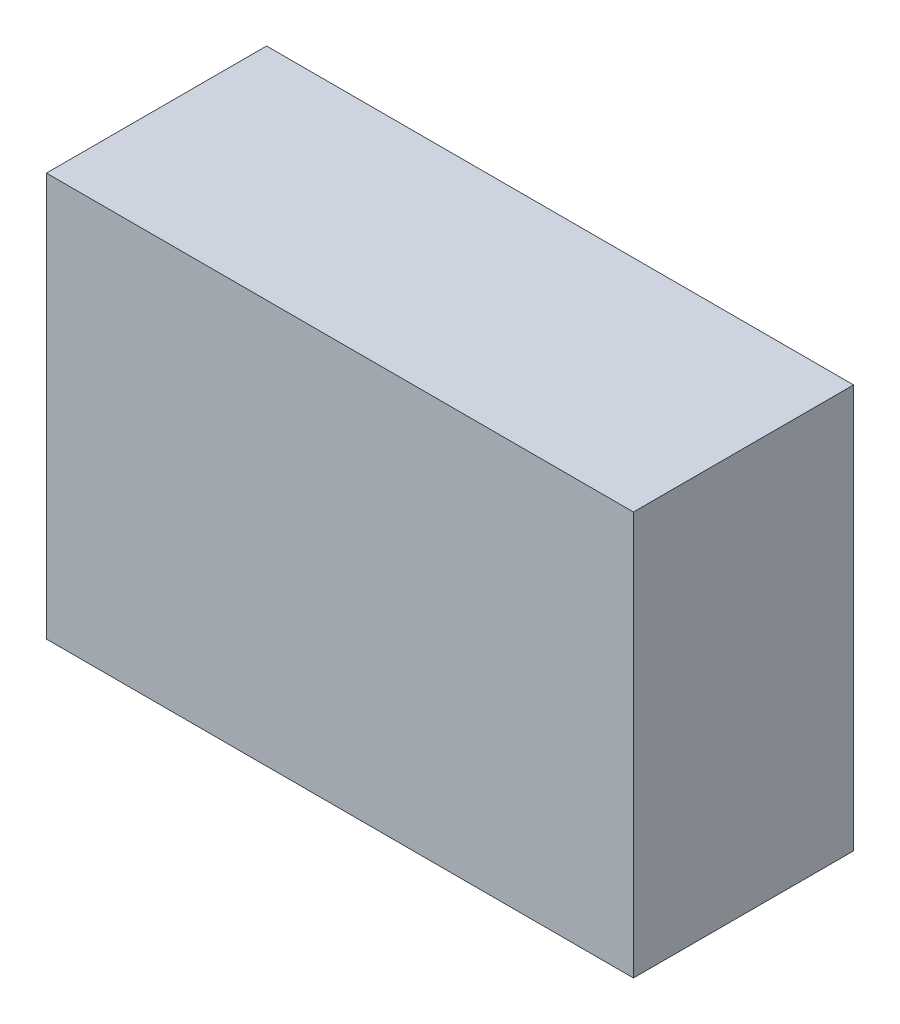
ISO-10303-21;
HEADER;
FILE_DESCRIPTION(('STEP AP214'),'2;1');
FILE_NAME('part.step','',(''),(''),'','','');
FILE_SCHEMA(('AUTOMOTIVE_DESIGN { 1 0 10303 214 1 1 1 1 }'));
ENDSEC;
DATA;
#1=APPLICATION_CONTEXT('core data for automotive mechanical design processes');
#2=APPLICATION_PROTOCOL_DEFINITION('international standard','automotive_design',2000,#1);
#3=PRODUCT_CONTEXT('',#1,'mechanical');
#4=PRODUCT('Part','Part','',(#3));
#5=PRODUCT_RELATED_PRODUCT_CATEGORY('part','',(#4));
#6=PRODUCT_DEFINITION_FORMATION('','',#4);
#7=PRODUCT_DEFINITION_CONTEXT('part definition',#1,'design');
#8=PRODUCT_DEFINITION('design','',#6,#7);
#9=PRODUCT_DEFINITION_SHAPE('','',#8);
#10=(LENGTH_UNIT() NAMED_UNIT(*) SI_UNIT(.MILLI.,.METRE.));
#11=(NAMED_UNIT(*) PLANE_ANGLE_UNIT() SI_UNIT($,.RADIAN.));
#12=(NAMED_UNIT(*) SI_UNIT($,.STERADIAN.) SOLID_ANGLE_UNIT());
#13=UNCERTAINTY_MEASURE_WITH_UNIT(LENGTH_MEASURE(1.E-05),#10,'distance_accuracy_value','');
#14=(GEOMETRIC_REPRESENTATION_CONTEXT(3) GLOBAL_UNCERTAINTY_ASSIGNED_CONTEXT((#13)) GLOBAL_UNIT_ASSIGNED_CONTEXT((#10,
#11,#12)) REPRESENTATION_CONTEXT('',''));
#15=CARTESIAN_POINT('',(0.,0.,0.));
#16=DIRECTION('',(0.,0.,1.));
#17=DIRECTION('',(1.,0.,0.));
#18=AXIS2_PLACEMENT_3D('',#15,#16,#17);
#19=CARTESIAN_POINT('',(-16.,-11.,12.));
#20=DIRECTION('',(0.,0.,1.));
#21=DIRECTION('',(1.,0.,0.));
#22=AXIS2_PLACEMENT_3D('',#19,#20,#21);
#23=PLANE('',#22);
#24=DIRECTION('',(0.,1.,0.));
#25=VECTOR('',#24,1.);
#26=CARTESIAN_POINT('',(-16.,-11.,12.));
#27=LINE('',#26,#25);
#28=CARTESIAN_POINT('',(-16.,-11.,12.));
#29=VERTEX_POINT('',#28);
#30=CARTESIAN_POINT('',(-16.,11.,12.));
#31=VERTEX_POINT('',#30);
#32=EDGE_CURVE('E87',#29,#31,#27,.T.);
#33=ORIENTED_EDGE('',*,*,#32,.F.);
#34=DIRECTION('',(1.,0.,0.));
#35=VECTOR('',#34,1.);
#36=CARTESIAN_POINT('',(-16.,-11.,12.));
#37=LINE('',#36,#35);
#38=CARTESIAN_POINT('',(16.,-11.,12.));
#39=VERTEX_POINT('',#38);
#40=EDGE_CURVE('E69',#29,#39,#37,.T.);
#41=ORIENTED_EDGE('',*,*,#40,.T.);
#42=DIRECTION('',(0.,1.,0.));
#43=VECTOR('',#42,1.);
#44=CARTESIAN_POINT('',(16.,-11.,12.));
#45=LINE('',#44,#43);
#46=CARTESIAN_POINT('',(16.,11.,12.));
#47=VERTEX_POINT('',#46);
#48=EDGE_CURVE('E81',#39,#47,#45,.T.);
#49=ORIENTED_EDGE('',*,*,#48,.T.);
#50=DIRECTION('',(1.,0.,0.));
#51=VECTOR('',#50,1.);
#52=CARTESIAN_POINT('',(-16.,11.,12.));
#53=LINE('',#52,#51);
#54=EDGE_CURVE('E10',#31,#47,#53,.T.);
#55=ORIENTED_EDGE('',*,*,#54,.F.);
#56=EDGE_LOOP('',(#33,#41,#49,#55));
#57=FACE_BOUND('',#56,.T.);
#58=ADVANCED_FACE('F16',(#57),#23,.T.);
#59=CARTESIAN_POINT('',(-16.,-11.,0.));
#60=DIRECTION('',(0.,0.,1.));
#61=DIRECTION('',(1.,0.,0.));
#62=AXIS2_PLACEMENT_3D('',#59,#60,#61);
#63=PLANE('',#62);
#64=DIRECTION('',(1.,0.,0.));
#65=VECTOR('',#64,1.);
#66=CARTESIAN_POINT('',(-16.,11.,0.));
#67=LINE('',#66,#65);
#68=CARTESIAN_POINT('',(-16.,11.,0.));
#69=VERTEX_POINT('',#68);
#70=CARTESIAN_POINT('',(16.,11.,0.));
#71=VERTEX_POINT('',#70);
#72=EDGE_CURVE('E24',#69,#71,#67,.T.);
#73=ORIENTED_EDGE('',*,*,#72,.T.);
#74=DIRECTION('',(0.,1.,0.));
#75=VECTOR('',#74,1.);
#76=CARTESIAN_POINT('',(16.,-11.,0.));
#77=LINE('',#76,#75);
#78=CARTESIAN_POINT('',(16.,-11.,0.));
#79=VERTEX_POINT('',#78);
#80=EDGE_CURVE('E104',#79,#71,#77,.T.);
#81=ORIENTED_EDGE('',*,*,#80,.F.);
#82=DIRECTION('',(1.,0.,0.));
#83=VECTOR('',#82,1.);
#84=CARTESIAN_POINT('',(-16.,-11.,0.));
#85=LINE('',#84,#83);
#86=CARTESIAN_POINT('',(-16.,-11.,0.));
#87=VERTEX_POINT('',#86);
#88=EDGE_CURVE('E80',#87,#79,#85,.T.);
#89=ORIENTED_EDGE('',*,*,#88,.F.);
#90=DIRECTION('',(0.,1.,0.));
#91=VECTOR('',#90,1.);
#92=CARTESIAN_POINT('',(-16.,-11.,0.));
#93=LINE('',#92,#91);
#94=EDGE_CURVE('E88',#87,#69,#93,.T.);
#95=ORIENTED_EDGE('',*,*,#94,.T.);
#96=EDGE_LOOP('',(#73,#81,#89,#95));
#97=FACE_BOUND('',#96,.T.);
#98=ADVANCED_FACE('F146',(#97),#63,.F.);
#99=CARTESIAN_POINT('',(-16.,11.,0.));
#100=DIRECTION('',(0.,1.,0.));
#101=DIRECTION('',(1.,0.,0.));
#102=AXIS2_PLACEMENT_3D('',#99,#100,#101);
#103=PLANE('',#102);
#104=ORIENTED_EDGE('',*,*,#72,.F.);
#105=DIRECTION('',(0.,0.,1.));
#106=VECTOR('',#105,1.);
#107=CARTESIAN_POINT('',(-16.,11.,0.));
#108=LINE('',#107,#106);
#109=EDGE_CURVE('E92',#69,#31,#108,.T.);
#110=ORIENTED_EDGE('',*,*,#109,.T.);
#111=ORIENTED_EDGE('',*,*,#54,.T.);
#112=DIRECTION('',(0.,0.,1.));
#113=VECTOR('',#112,1.);
#114=CARTESIAN_POINT('',(16.,11.,0.));
#115=LINE('',#114,#113);
#116=EDGE_CURVE('E108',#71,#47,#115,.T.);
#117=ORIENTED_EDGE('',*,*,#116,.F.);
#118=EDGE_LOOP('',(#104,#110,#111,#117));
#119=FACE_BOUND('',#118,.T.);
#120=ADVANCED_FACE('F139',(#119),#103,.T.);
#121=CARTESIAN_POINT('',(-16.,-11.,0.));
#122=DIRECTION('',(0.,1.,0.));
#123=DIRECTION('',(1.,0.,0.));
#124=AXIS2_PLACEMENT_3D('',#121,#122,#123);
#125=PLANE('',#124);
#126=DIRECTION('',(0.,0.,1.));
#127=VECTOR('',#126,1.);
#128=CARTESIAN_POINT('',(16.,-11.,0.));
#129=LINE('',#128,#127);
#130=EDGE_CURVE('E75',#79,#39,#129,.T.);
#131=ORIENTED_EDGE('',*,*,#130,.T.);
#132=ORIENTED_EDGE('',*,*,#40,.F.);
#133=DIRECTION('',(0.,0.,1.));
#134=VECTOR('',#133,1.);
#135=CARTESIAN_POINT('',(-16.,-11.,0.));
#136=LINE('',#135,#134);
#137=EDGE_CURVE('E72',#87,#29,#136,.T.);
#138=ORIENTED_EDGE('',*,*,#137,.F.);
#139=ORIENTED_EDGE('',*,*,#88,.T.);
#140=EDGE_LOOP('',(#131,#132,#138,#139));
#141=FACE_BOUND('',#140,.T.);
#142=ADVANCED_FACE('F71',(#141),#125,.F.);
#143=CARTESIAN_POINT('',(16.,-11.,0.));
#144=DIRECTION('',(1.,0.,0.));
#145=DIRECTION('',(0.,1.,0.));
#146=AXIS2_PLACEMENT_3D('',#143,#144,#145);
#147=PLANE('',#146);
#148=ORIENTED_EDGE('',*,*,#130,.F.);
#149=ORIENTED_EDGE('',*,*,#80,.T.);
#150=ORIENTED_EDGE('',*,*,#116,.T.);
#151=ORIENTED_EDGE('',*,*,#48,.F.);
#152=EDGE_LOOP('',(#148,#149,#150,#151));
#153=FACE_BOUND('',#152,.T.);
#154=ADVANCED_FACE('F124',(#153),#147,.T.);
#155=CARTESIAN_POINT('',(-16.,-11.,0.));
#156=DIRECTION('',(1.,0.,0.));
#157=DIRECTION('',(0.,1.,0.));
#158=AXIS2_PLACEMENT_3D('',#155,#156,#157);
#159=PLANE('',#158);
#160=ORIENTED_EDGE('',*,*,#32,.T.);
#161=ORIENTED_EDGE('',*,*,#109,.F.);
#162=ORIENTED_EDGE('',*,*,#94,.F.);
#163=ORIENTED_EDGE('',*,*,#137,.T.);
#164=EDGE_LOOP('',(#160,#161,#162,#163));
#165=FACE_BOUND('',#164,.T.);
#166=ADVANCED_FACE('F85',(#165),#159,.F.);
#167=CLOSED_SHELL('',(#58,#98,#120,#142,#154,#166));
#168=MANIFOLD_SOLID_BREP('B1',#167);
#169=ADVANCED_BREP_SHAPE_REPRESENTATION('',(#18,#168),#14);
#170=SHAPE_DEFINITION_REPRESENTATION(#9,#169);
ENDSEC;
END-ISO-10303-21;
